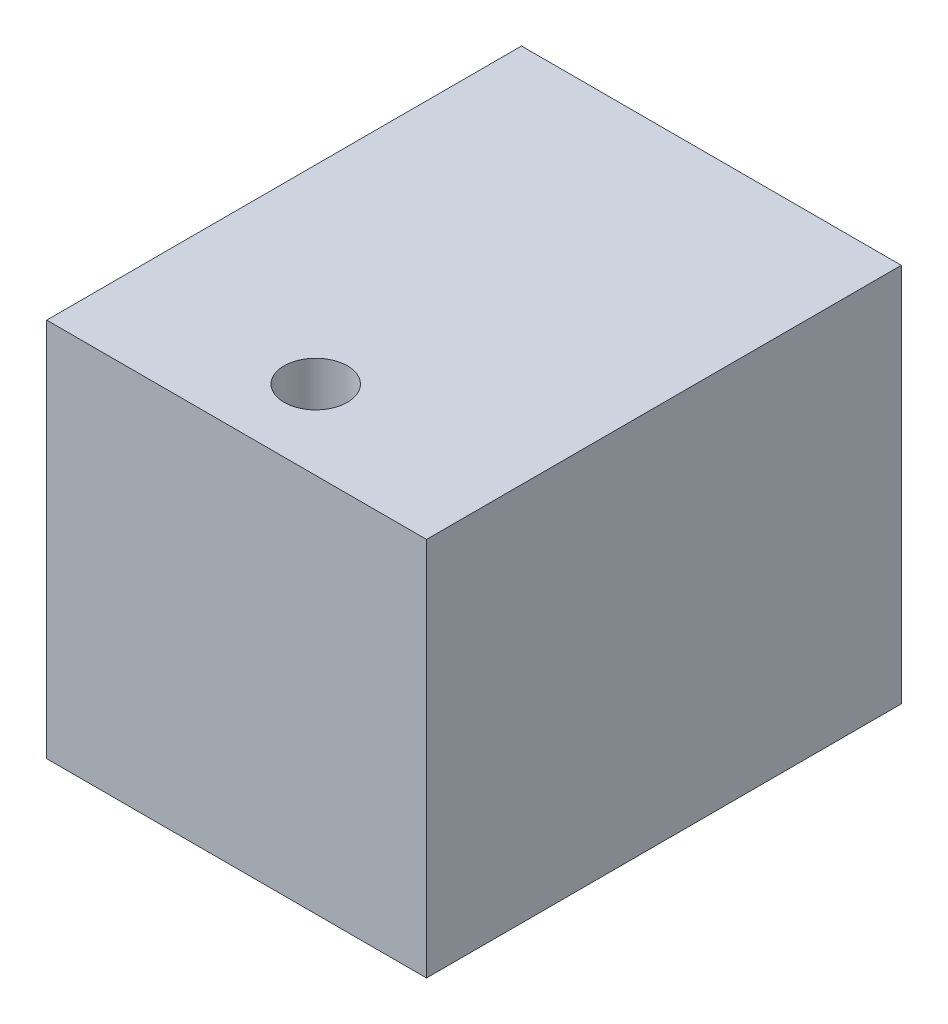
ISO-10303-21;
HEADER;
FILE_DESCRIPTION(('STEP AP214'),'2;1');
FILE_NAME('part.step','',(''),(''),'','','');
FILE_SCHEMA(('AUTOMOTIVE_DESIGN { 1 0 10303 214 1 1 1 1 }'));
ENDSEC;
DATA;
#1=APPLICATION_CONTEXT('core data for automotive mechanical design processes');
#2=APPLICATION_PROTOCOL_DEFINITION('international standard','automotive_design',2000,#1);
#3=PRODUCT_CONTEXT('',#1,'mechanical');
#4=PRODUCT('Part','Part','',(#3));
#5=PRODUCT_RELATED_PRODUCT_CATEGORY('part','',(#4));
#6=PRODUCT_DEFINITION_FORMATION('','',#4);
#7=PRODUCT_DEFINITION_CONTEXT('part definition',#1,'design');
#8=PRODUCT_DEFINITION('design','',#6,#7);
#9=PRODUCT_DEFINITION_SHAPE('','',#8);
#10=(LENGTH_UNIT() NAMED_UNIT(*) SI_UNIT(.MILLI.,.METRE.));
#11=(NAMED_UNIT(*) PLANE_ANGLE_UNIT() SI_UNIT($,.RADIAN.));
#12=(NAMED_UNIT(*) SI_UNIT($,.STERADIAN.) SOLID_ANGLE_UNIT());
#13=UNCERTAINTY_MEASURE_WITH_UNIT(LENGTH_MEASURE(1.E-05),#10,'distance_accuracy_value','');
#14=(GEOMETRIC_REPRESENTATION_CONTEXT(3) GLOBAL_UNCERTAINTY_ASSIGNED_CONTEXT((#13)) GLOBAL_UNIT_ASSIGNED_CONTEXT((#10,
#11,#12)) REPRESENTATION_CONTEXT('',''));
#15=CARTESIAN_POINT('',(0.,0.,0.));
#16=DIRECTION('',(0.,0.,1.));
#17=DIRECTION('',(1.,0.,0.));
#18=AXIS2_PLACEMENT_3D('',#15,#16,#17);
#19=CARTESIAN_POINT('',(0.,0.,0.));
#20=DIRECTION('',(0.,0.,-1.));
#21=DIRECTION('',(-1.,0.,0.));
#22=AXIS2_PLACEMENT_3D('',#19,#20,#21);
#23=PLANE('',#22);
#24=DIRECTION('',(0.,-1.,0.));
#25=VECTOR('',#24,1.);
#26=CARTESIAN_POINT('',(0.,0.,0.));
#27=LINE('',#26,#25);
#28=CARTESIAN_POINT('',(0.,12.,0.));
#29=VERTEX_POINT('',#28);
#30=CARTESIAN_POINT('',(0.,0.,0.));
#31=VERTEX_POINT('',#30);
#32=EDGE_CURVE('E110',#29,#31,#27,.T.);
#33=ORIENTED_EDGE('',*,*,#32,.F.);
#34=DIRECTION('',(-1.,0.,0.));
#35=VECTOR('',#34,1.);
#36=CARTESIAN_POINT('',(0.,12.,0.));
#37=LINE('',#36,#35);
#38=CARTESIAN_POINT('',(12.,12.,0.));
#39=VERTEX_POINT('',#38);
#40=EDGE_CURVE('E61',#39,#29,#37,.T.);
#41=ORIENTED_EDGE('',*,*,#40,.F.);
#42=DIRECTION('',(0.,1.,0.));
#43=VECTOR('',#42,1.);
#44=CARTESIAN_POINT('',(12.,0.,0.));
#45=LINE('',#44,#43);
#46=CARTESIAN_POINT('',(12.,0.,0.));
#47=VERTEX_POINT('',#46);
#48=EDGE_CURVE('E186',#47,#39,#45,.T.);
#49=ORIENTED_EDGE('',*,*,#48,.F.);
#50=DIRECTION('',(1.,0.,0.));
#51=VECTOR('',#50,1.);
#52=CARTESIAN_POINT('',(0.,0.,0.));
#53=LINE('',#52,#51);
#54=EDGE_CURVE('E183',#31,#47,#53,.T.);
#55=ORIENTED_EDGE('',*,*,#54,.F.);
#56=EDGE_LOOP('',(#33,#41,#49,#55));
#57=FACE_BOUND('',#56,.T.);
#58=DIRECTION('',(-1.,0.,0.));
#59=VECTOR('',#58,1.);
#60=CARTESIAN_POINT('',(1.,11.,0.));
#61=LINE('',#60,#59);
#62=CARTESIAN_POINT('',(11.,11.,0.));
#63=VERTEX_POINT('',#62);
#64=CARTESIAN_POINT('',(1.,11.,0.));
#65=VERTEX_POINT('',#64);
#66=EDGE_CURVE('E144',#63,#65,#61,.T.);
#67=ORIENTED_EDGE('',*,*,#66,.T.);
#68=DIRECTION('',(0.,-1.,0.));
#69=VECTOR('',#68,1.);
#70=CARTESIAN_POINT('',(1.,1.,0.));
#71=LINE('',#70,#69);
#72=CARTESIAN_POINT('',(1.,1.,0.));
#73=VERTEX_POINT('',#72);
#74=EDGE_CURVE('E53',#65,#73,#71,.T.);
#75=ORIENTED_EDGE('',*,*,#74,.T.);
#76=DIRECTION('',(1.,0.,0.));
#77=VECTOR('',#76,1.);
#78=CARTESIAN_POINT('',(1.,1.,0.));
#79=LINE('',#78,#77);
#80=CARTESIAN_POINT('',(11.,1.,0.));
#81=VERTEX_POINT('',#80);
#82=EDGE_CURVE('E159',#73,#81,#79,.T.);
#83=ORIENTED_EDGE('',*,*,#82,.T.);
#84=DIRECTION('',(0.,1.,0.));
#85=VECTOR('',#84,1.);
#86=CARTESIAN_POINT('',(11.,1.,0.));
#87=LINE('',#86,#85);
#88=EDGE_CURVE('E163',#81,#63,#87,.T.);
#89=ORIENTED_EDGE('',*,*,#88,.T.);
#90=EDGE_LOOP('',(#67,#75,#83,#89));
#91=FACE_BOUND('',#90,.T.);
#92=ADVANCED_FACE('F37',(#57,#91),#23,.T.);
#93=CARTESIAN_POINT('',(0.,0.,10.));
#94=DIRECTION('',(1.,0.,0.));
#95=DIRECTION('',(0.,0.,-1.));
#96=AXIS2_PLACEMENT_3D('',#93,#94,#95);
#97=PLANE('',#96);
#98=ORIENTED_EDGE('',*,*,#32,.T.);
#99=DIRECTION('',(0.,0.,-1.));
#100=VECTOR('',#99,1.);
#101=CARTESIAN_POINT('',(0.,0.,10.));
#102=LINE('',#101,#100);
#103=CARTESIAN_POINT('',(0.,0.,15.));
#104=VERTEX_POINT('',#103);
#105=EDGE_CURVE('E11',#104,#31,#102,.T.);
#106=ORIENTED_EDGE('',*,*,#105,.F.);
#107=DIRECTION('',(0.,-1.,0.));
#108=VECTOR('',#107,1.);
#109=CARTESIAN_POINT('',(0.,12.,15.));
#110=LINE('',#109,#108);
#111=CARTESIAN_POINT('',(0.,12.,15.));
#112=VERTEX_POINT('',#111);
#113=EDGE_CURVE('E108',#112,#104,#110,.T.);
#114=ORIENTED_EDGE('',*,*,#113,.F.);
#115=DIRECTION('',(0.,0.,-1.));
#116=VECTOR('',#115,1.);
#117=CARTESIAN_POINT('',(0.,12.,10.));
#118=LINE('',#117,#116);
#119=EDGE_CURVE('E191',#112,#29,#118,.T.);
#120=ORIENTED_EDGE('',*,*,#119,.T.);
#121=EDGE_LOOP('',(#98,#106,#114,#120));
#122=FACE_BOUND('',#121,.T.);
#123=ADVANCED_FACE('F39',(#122),#97,.F.);
#124=CARTESIAN_POINT('',(0.,0.,10.));
#125=DIRECTION('',(0.,1.,0.));
#126=DIRECTION('',(0.,0.,1.));
#127=AXIS2_PLACEMENT_3D('',#124,#125,#126);
#128=PLANE('',#127);
#129=CARTESIAN_POINT('',(6.,0.,12.5));
#130=DIRECTION('',(0.,-1.,0.));
#131=DIRECTION('',(0.,0.,-1.));
#132=AXIS2_PLACEMENT_3D('',#129,#130,#131);
#133=CIRCLE('',#132,1.);
#134=CARTESIAN_POINT('',(6.,0.,11.5));
#135=VERTEX_POINT('',#134);
#136=EDGE_CURVE('E131',#135,#135,#133,.T.);
#137=ORIENTED_EDGE('',*,*,#136,.F.);
#138=EDGE_LOOP('',(#137));
#139=FACE_BOUND('',#138,.T.);
#140=ORIENTED_EDGE('',*,*,#54,.T.);
#141=DIRECTION('',(0.,0.,-1.));
#142=VECTOR('',#141,1.);
#143=CARTESIAN_POINT('',(12.,0.,10.));
#144=LINE('',#143,#142);
#145=CARTESIAN_POINT('',(12.,0.,15.));
#146=VERTEX_POINT('',#145);
#147=EDGE_CURVE('E46',#146,#47,#144,.T.);
#148=ORIENTED_EDGE('',*,*,#147,.F.);
#149=DIRECTION('',(1.,0.,0.));
#150=VECTOR('',#149,1.);
#151=CARTESIAN_POINT('',(0.,0.,15.));
#152=LINE('',#151,#150);
#153=EDGE_CURVE('E113',#104,#146,#152,.T.);
#154=ORIENTED_EDGE('',*,*,#153,.F.);
#155=ORIENTED_EDGE('',*,*,#105,.T.);
#156=EDGE_LOOP('',(#140,#148,#154,#155));
#157=FACE_BOUND('',#156,.T.);
#158=ADVANCED_FACE('F114',(#139,#157),#128,.F.);
#159=CARTESIAN_POINT('',(12.,0.,10.));
#160=DIRECTION('',(-1.,0.,0.));
#161=DIRECTION('',(0.,0.,1.));
#162=AXIS2_PLACEMENT_3D('',#159,#160,#161);
#163=PLANE('',#162);
#164=ORIENTED_EDGE('',*,*,#48,.T.);
#165=DIRECTION('',(0.,0.,-1.));
#166=VECTOR('',#165,1.);
#167=CARTESIAN_POINT('',(12.,12.,10.));
#168=LINE('',#167,#166);
#169=CARTESIAN_POINT('',(12.,12.,15.));
#170=VERTEX_POINT('',#169);
#171=EDGE_CURVE('E194',#170,#39,#168,.T.);
#172=ORIENTED_EDGE('',*,*,#171,.F.);
#173=DIRECTION('',(0.,1.,0.));
#174=VECTOR('',#173,1.);
#175=CARTESIAN_POINT('',(12.,12.,15.));
#176=LINE('',#175,#174);
#177=EDGE_CURVE('E120',#146,#170,#176,.T.);
#178=ORIENTED_EDGE('',*,*,#177,.F.);
#179=ORIENTED_EDGE('',*,*,#147,.T.);
#180=EDGE_LOOP('',(#164,#172,#178,#179));
#181=FACE_BOUND('',#180,.T.);
#182=ADVANCED_FACE('F199',(#181),#163,.F.);
#183=CARTESIAN_POINT('',(0.,12.,10.));
#184=DIRECTION('',(0.,-1.,0.));
#185=DIRECTION('',(0.,0.,-1.));
#186=AXIS2_PLACEMENT_3D('',#183,#184,#185);
#187=PLANE('',#186);
#188=CARTESIAN_POINT('',(6.,12.,12.5));
#189=DIRECTION('',(0.,-1.,0.));
#190=DIRECTION('',(0.,0.,-1.));
#191=AXIS2_PLACEMENT_3D('',#188,#189,#190);
#192=CIRCLE('',#191,1.);
#193=CARTESIAN_POINT('',(6.,12.,11.5));
#194=VERTEX_POINT('',#193);
#195=EDGE_CURVE('E127',#194,#194,#192,.T.);
#196=ORIENTED_EDGE('',*,*,#195,.T.);
#197=EDGE_LOOP('',(#196));
#198=FACE_BOUND('',#197,.T.);
#199=ORIENTED_EDGE('',*,*,#40,.T.);
#200=ORIENTED_EDGE('',*,*,#119,.F.);
#201=DIRECTION('',(-1.,0.,0.));
#202=VECTOR('',#201,1.);
#203=CARTESIAN_POINT('',(0.,12.,15.));
#204=LINE('',#203,#202);
#205=EDGE_CURVE('E125',#170,#112,#204,.T.);
#206=ORIENTED_EDGE('',*,*,#205,.F.);
#207=ORIENTED_EDGE('',*,*,#171,.T.);
#208=EDGE_LOOP('',(#199,#200,#206,#207));
#209=FACE_BOUND('',#208,.T.);
#210=ADVANCED_FACE('F234',(#198,#209),#187,.F.);
#211=CARTESIAN_POINT('',(1.,1.,10.));
#212=DIRECTION('',(1.,0.,0.));
#213=DIRECTION('',(0.,0.,-1.));
#214=AXIS2_PLACEMENT_3D('',#211,#212,#213);
#215=PLANE('',#214);
#216=ORIENTED_EDGE('',*,*,#74,.F.);
#217=DIRECTION('',(0.,0.,-1.));
#218=VECTOR('',#217,1.);
#219=CARTESIAN_POINT('',(1.,11.,10.));
#220=LINE('',#219,#218);
#221=CARTESIAN_POINT('',(1.,11.,10.));
#222=VERTEX_POINT('',#221);
#223=EDGE_CURVE('E156',#222,#65,#220,.T.);
#224=ORIENTED_EDGE('',*,*,#223,.F.);
#225=DIRECTION('',(0.,-1.,0.));
#226=VECTOR('',#225,1.);
#227=CARTESIAN_POINT('',(1.,1.,10.));
#228=LINE('',#227,#226);
#229=CARTESIAN_POINT('',(1.,1.,10.));
#230=VERTEX_POINT('',#229);
#231=EDGE_CURVE('E139',#222,#230,#228,.T.);
#232=ORIENTED_EDGE('',*,*,#231,.T.);
#233=DIRECTION('',(0.,0.,-1.));
#234=VECTOR('',#233,1.);
#235=CARTESIAN_POINT('',(1.,1.,10.));
#236=LINE('',#235,#234);
#237=EDGE_CURVE('E178',#230,#73,#236,.T.);
#238=ORIENTED_EDGE('',*,*,#237,.T.);
#239=EDGE_LOOP('',(#216,#224,#232,#238));
#240=FACE_BOUND('',#239,.T.);
#241=ADVANCED_FACE('F209',(#240),#215,.T.);
#242=CARTESIAN_POINT('',(1.,1.,10.));
#243=DIRECTION('',(0.,1.,0.));
#244=DIRECTION('',(0.,0.,1.));
#245=AXIS2_PLACEMENT_3D('',#242,#243,#244);
#246=PLANE('',#245);
#247=ORIENTED_EDGE('',*,*,#82,.F.);
#248=ORIENTED_EDGE('',*,*,#237,.F.);
#249=DIRECTION('',(1.,0.,0.));
#250=VECTOR('',#249,1.);
#251=CARTESIAN_POINT('',(1.,1.,10.));
#252=LINE('',#251,#250);
#253=CARTESIAN_POINT('',(11.,1.,10.));
#254=VERTEX_POINT('',#253);
#255=EDGE_CURVE('E143',#230,#254,#252,.T.);
#256=ORIENTED_EDGE('',*,*,#255,.T.);
#257=DIRECTION('',(0.,0.,-1.));
#258=VECTOR('',#257,1.);
#259=CARTESIAN_POINT('',(11.,1.,10.));
#260=LINE('',#259,#258);
#261=EDGE_CURVE('E175',#254,#81,#260,.T.);
#262=ORIENTED_EDGE('',*,*,#261,.T.);
#263=EDGE_LOOP('',(#247,#248,#256,#262));
#264=FACE_BOUND('',#263,.T.);
#265=ADVANCED_FACE('F213',(#264),#246,.T.);
#266=CARTESIAN_POINT('',(11.,1.,10.));
#267=DIRECTION('',(-1.,0.,0.));
#268=DIRECTION('',(0.,0.,1.));
#269=AXIS2_PLACEMENT_3D('',#266,#267,#268);
#270=PLANE('',#269);
#271=ORIENTED_EDGE('',*,*,#88,.F.);
#272=ORIENTED_EDGE('',*,*,#261,.F.);
#273=DIRECTION('',(0.,1.,0.));
#274=VECTOR('',#273,1.);
#275=CARTESIAN_POINT('',(11.,1.,10.));
#276=LINE('',#275,#274);
#277=CARTESIAN_POINT('',(11.,11.,10.));
#278=VERTEX_POINT('',#277);
#279=EDGE_CURVE('E148',#254,#278,#276,.T.);
#280=ORIENTED_EDGE('',*,*,#279,.T.);
#281=DIRECTION('',(0.,0.,-1.));
#282=VECTOR('',#281,1.);
#283=CARTESIAN_POINT('',(11.,11.,10.));
#284=LINE('',#283,#282);
#285=EDGE_CURVE('E172',#278,#63,#284,.T.);
#286=ORIENTED_EDGE('',*,*,#285,.T.);
#287=EDGE_LOOP('',(#271,#272,#280,#286));
#288=FACE_BOUND('',#287,.T.);
#289=ADVANCED_FACE('F216',(#288),#270,.T.);
#290=CARTESIAN_POINT('',(1.,11.,10.));
#291=DIRECTION('',(0.,-1.,0.));
#292=DIRECTION('',(0.,0.,-1.));
#293=AXIS2_PLACEMENT_3D('',#290,#291,#292);
#294=PLANE('',#293);
#295=ORIENTED_EDGE('',*,*,#66,.F.);
#296=ORIENTED_EDGE('',*,*,#285,.F.);
#297=DIRECTION('',(-1.,0.,0.));
#298=VECTOR('',#297,1.);
#299=CARTESIAN_POINT('',(1.,11.,10.));
#300=LINE('',#299,#298);
#301=EDGE_CURVE('E152',#278,#222,#300,.T.);
#302=ORIENTED_EDGE('',*,*,#301,.T.);
#303=ORIENTED_EDGE('',*,*,#223,.T.);
#304=EDGE_LOOP('',(#295,#296,#302,#303));
#305=FACE_BOUND('',#304,.T.);
#306=ADVANCED_FACE('F208',(#305),#294,.T.);
#307=CARTESIAN_POINT('',(0.,0.,10.));
#308=DIRECTION('',(0.,0.,1.));
#309=DIRECTION('',(1.,0.,0.));
#310=AXIS2_PLACEMENT_3D('',#307,#308,#309);
#311=PLANE('',#310);
#312=ORIENTED_EDGE('',*,*,#231,.F.);
#313=ORIENTED_EDGE('',*,*,#301,.F.);
#314=ORIENTED_EDGE('',*,*,#279,.F.);
#315=ORIENTED_EDGE('',*,*,#255,.F.);
#316=EDGE_LOOP('',(#312,#313,#314,#315));
#317=FACE_BOUND('',#316,.T.);
#318=ADVANCED_FACE('F217',(#317),#311,.F.);
#319=CARTESIAN_POINT('',(0.,0.,15.));
#320=DIRECTION('',(0.,0.,1.));
#321=DIRECTION('',(1.,0.,0.));
#322=AXIS2_PLACEMENT_3D('',#319,#320,#321);
#323=PLANE('',#322);
#324=ORIENTED_EDGE('',*,*,#113,.T.);
#325=ORIENTED_EDGE('',*,*,#153,.T.);
#326=ORIENTED_EDGE('',*,*,#177,.T.);
#327=ORIENTED_EDGE('',*,*,#205,.T.);
#328=EDGE_LOOP('',(#324,#325,#326,#327));
#329=FACE_BOUND('',#328,.T.);
#330=ADVANCED_FACE('F123',(#329),#323,.T.);
#331=CARTESIAN_POINT('',(6.,12.,12.5));
#332=DIRECTION('',(0.,-1.,0.));
#333=DIRECTION('',(0.,0.,-1.));
#334=AXIS2_PLACEMENT_3D('',#331,#332,#333);
#335=CYLINDRICAL_SURFACE('',#334,1.);
#336=ORIENTED_EDGE('',*,*,#195,.F.);
#337=EDGE_LOOP('',(#336));
#338=FACE_BOUND('',#337,.T.);
#339=ORIENTED_EDGE('',*,*,#136,.T.);
#340=EDGE_LOOP('',(#339));
#341=FACE_BOUND('',#340,.T.);
#342=ADVANCED_FACE('F224',(#338,#341),#335,.F.);
#343=CLOSED_SHELL('',(#92,#123,#158,#182,#210,#241,#265,#289,#306,#318,#330,#342));
#344=MANIFOLD_SOLID_BREP('B2',#343);
#345=ADVANCED_BREP_SHAPE_REPRESENTATION('',(#18,#344),#14);
#346=SHAPE_DEFINITION_REPRESENTATION(#9,#345);
ENDSEC;
END-ISO-10303-21;
